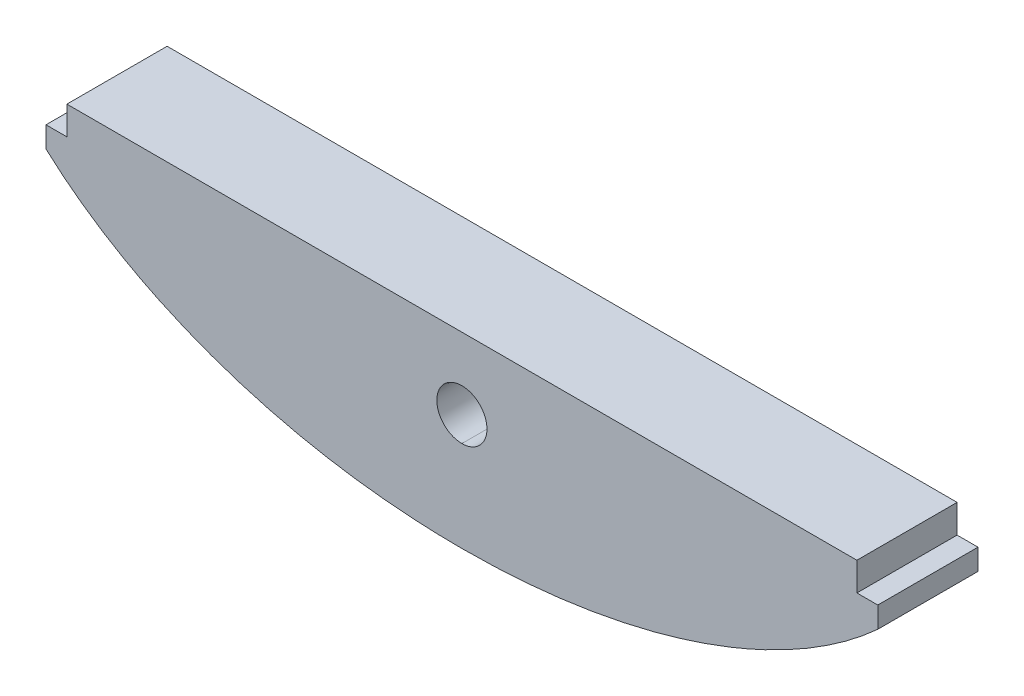
ISO-10303-21;
HEADER;
FILE_DESCRIPTION(('STEP AP214'),'2;1');
FILE_NAME('part.step','',(''),(''),'','','');
FILE_SCHEMA(('AUTOMOTIVE_DESIGN { 1 0 10303 214 1 1 1 1 }'));
ENDSEC;
DATA;
#1=APPLICATION_CONTEXT('core data for automotive mechanical design processes');
#2=APPLICATION_PROTOCOL_DEFINITION('international standard','automotive_design',2000,#1);
#3=PRODUCT_CONTEXT('',#1,'mechanical');
#4=PRODUCT('Part','Part','',(#3));
#5=PRODUCT_RELATED_PRODUCT_CATEGORY('part','',(#4));
#6=PRODUCT_DEFINITION_FORMATION('','',#4);
#7=PRODUCT_DEFINITION_CONTEXT('part definition',#1,'design');
#8=PRODUCT_DEFINITION('design','',#6,#7);
#9=PRODUCT_DEFINITION_SHAPE('','',#8);
#10=(LENGTH_UNIT() NAMED_UNIT(*) SI_UNIT(.MILLI.,.METRE.));
#11=(NAMED_UNIT(*) PLANE_ANGLE_UNIT() SI_UNIT($,.RADIAN.));
#12=(NAMED_UNIT(*) SI_UNIT($,.STERADIAN.) SOLID_ANGLE_UNIT());
#13=UNCERTAINTY_MEASURE_WITH_UNIT(LENGTH_MEASURE(1.E-05),#10,'distance_accuracy_value','');
#14=(GEOMETRIC_REPRESENTATION_CONTEXT(3) GLOBAL_UNCERTAINTY_ASSIGNED_CONTEXT((#13)) GLOBAL_UNIT_ASSIGNED_CONTEXT((#10,
#11,#12)) REPRESENTATION_CONTEXT('',''));
#15=CARTESIAN_POINT('',(0.,0.,0.));
#16=DIRECTION('',(0.,0.,1.));
#17=DIRECTION('',(1.,0.,0.));
#18=AXIS2_PLACEMENT_3D('',#15,#16,#17);
#19=CARTESIAN_POINT('',(-60.6492238058877,-4.51197664010296,10.));
#20=DIRECTION('',(0.,0.,-1.));
#21=DIRECTION('',(-1.,0.,0.));
#22=AXIS2_PLACEMENT_3D('',#19,#20,#21);
#23=PLANE('',#22);
#24=DIRECTION('',(-1.,0.,0.));
#25=VECTOR('',#24,1.);
#26=CARTESIAN_POINT('',(17.1731173942409,1.5862380164739,10.));
#27=LINE('',#26,#25);
#28=CARTESIAN_POINT('',(17.1731173942409,1.5862380164739,10.));
#29=VERTEX_POINT('',#28);
#30=CARTESIAN_POINT('',(15.0881886702613,1.5862380164739,10.));
#31=VERTEX_POINT('',#30);
#32=EDGE_CURVE('E238',#29,#31,#27,.T.);
#33=ORIENTED_EDGE('',*,*,#32,.T.);
#34=DIRECTION('',(0.,1.,0.));
#35=VECTOR('',#34,1.);
#36=CARTESIAN_POINT('',(15.0881886702613,1.5862380164739,10.));
#37=LINE('',#36,#35);
#38=CARTESIAN_POINT('',(15.0881886702613,4.41550115188855,10.));
#39=VERTEX_POINT('',#38);
#40=EDGE_CURVE('E328',#31,#39,#37,.T.);
#41=ORIENTED_EDGE('',*,*,#40,.T.);
#42=DIRECTION('',(-1.,0.,0.));
#43=VECTOR('',#42,1.);
#44=CARTESIAN_POINT('',(15.0881886702613,4.41550115188855,10.));
#45=LINE('',#44,#43);
#46=CARTESIAN_POINT('',(-63.7435197518711,4.41550115188855,10.));
#47=VERTEX_POINT('',#46);
#48=EDGE_CURVE('E271',#39,#47,#45,.T.);
#49=ORIENTED_EDGE('',*,*,#48,.T.);
#50=DIRECTION('',(0.,-1.,0.));
#51=VECTOR('',#50,1.);
#52=CARTESIAN_POINT('',(-63.7435197518711,4.41550115188855,10.));
#53=LINE('',#52,#51);
#54=CARTESIAN_POINT('',(-63.7435197518711,1.5862380164739,10.));
#55=VERTEX_POINT('',#54);
#56=EDGE_CURVE('E289',#47,#55,#53,.T.);
#57=ORIENTED_EDGE('',*,*,#56,.T.);
#58=DIRECTION('',(-1.,0.,0.));
#59=VECTOR('',#58,1.);
#60=CARTESIAN_POINT('',(-63.7435197518711,1.5862380164739,10.));
#61=LINE('',#60,#59);
#62=CARTESIAN_POINT('',(-65.8284484758507,1.5862380164739,10.));
#63=VERTEX_POINT('',#62);
#64=EDGE_CURVE('E286',#55,#63,#61,.T.);
#65=ORIENTED_EDGE('',*,*,#64,.T.);
#66=DIRECTION('',(0.,-1.,0.));
#67=VECTOR('',#66,1.);
#68=CARTESIAN_POINT('',(-65.8284484758507,1.5862380164739,10.));
#69=LINE('',#68,#67);
#70=CARTESIAN_POINT('',(-65.8284484758507,-0.512794067148492,10.));
#71=VERTEX_POINT('',#70);
#72=EDGE_CURVE('E288',#63,#71,#69,.T.);
#73=ORIENTED_EDGE('',*,*,#72,.T.);
#74=CARTESIAN_POINT('',(-65.8284484758507,-0.512794067148492,10.));
#75=CARTESIAN_POINT('',(-62.716945892807,-3.35618209405267,10.));
#76=CARTESIAN_POINT('',(-58.8963565315117,-5.86091723475676,10.));
#77=CARTESIAN_POINT('',(-54.5254346982945,-7.93172106724688,10.));
#78=B_SPLINE_CURVE_WITH_KNOTS('',3,(#74,#75,#76,#77),.UNSPECIFIED.,.F.,.F.,(4,4),(5.,6.),.UNSPECIFIED.);
#79=CARTESIAN_POINT('',(-54.5254346982945,-7.93172106724688,10.));
#80=VERTEX_POINT('',#79);
#81=EDGE_CURVE('E291',#71,#80,#78,.T.);
#82=ORIENTED_EDGE('',*,*,#81,.T.);
#83=CARTESIAN_POINT('',(-54.5254346982945,-7.93172106724688,10.));
#84=CARTESIAN_POINT('',(-46.1081620902643,-11.9216368716422,10.));
#85=CARTESIAN_POINT('',(-35.6518235919018,-14.2817210656594,10.));
#86=CARTESIAN_POINT('',(-24.3276655408049,-14.2817210656594,10.));
#87=B_SPLINE_CURVE_WITH_KNOTS('',3,(#83,#84,#85,#86),.UNSPECIFIED.,.F.,.F.,(4,4),(6.,7.),.UNSPECIFIED.);
#88=CARTESIAN_POINT('',(-24.3276655408049,-14.2817210656594,10.));
#89=VERTEX_POINT('',#88);
#90=EDGE_CURVE('E299',#80,#89,#87,.T.);
#91=ORIENTED_EDGE('',*,*,#90,.T.);
#92=CARTESIAN_POINT('',(-24.3276655408049,-14.2817210656594,10.));
#93=CARTESIAN_POINT('',(-13.003507489708,-14.2817210656594,10.));
#94=CARTESIAN_POINT('',(-2.54716899134551,-11.9216368716422,10.));
#95=CARTESIAN_POINT('',(5.87010361668473,-7.93172106724688,10.));
#96=B_SPLINE_CURVE_WITH_KNOTS('',3,(#92,#93,#94,#95),.UNSPECIFIED.,.F.,.F.,(4,4),(7.,8.),.UNSPECIFIED.);
#97=CARTESIAN_POINT('',(5.87010361668473,-7.93172106724688,10.));
#98=VERTEX_POINT('',#97);
#99=EDGE_CURVE('E185',#89,#98,#96,.T.);
#100=ORIENTED_EDGE('',*,*,#99,.T.);
#101=CARTESIAN_POINT('',(5.87010361668473,-7.93172106724688,10.));
#102=CARTESIAN_POINT('',(10.2410254499019,-5.86091723475676,10.));
#103=CARTESIAN_POINT('',(14.0616148111972,-3.35618209405267,10.));
#104=CARTESIAN_POINT('',(17.1731173942409,-0.512794067148492,10.));
#105=B_SPLINE_CURVE_WITH_KNOTS('',3,(#101,#102,#103,#104),.UNSPECIFIED.,.F.,.F.,(4,4),(8.,9.),.UNSPECIFIED.);
#106=CARTESIAN_POINT('',(17.1731173942409,-0.512794067148492,10.));
#107=VERTEX_POINT('',#106);
#108=EDGE_CURVE('E179',#98,#107,#105,.T.);
#109=ORIENTED_EDGE('',*,*,#108,.T.);
#110=DIRECTION('',(0.,1.,0.));
#111=VECTOR('',#110,1.);
#112=CARTESIAN_POINT('',(17.1731173942409,-0.512794067148492,10.));
#113=LINE('',#112,#111);
#114=EDGE_CURVE('E184',#107,#29,#113,.T.);
#115=ORIENTED_EDGE('',*,*,#114,.T.);
#116=EDGE_LOOP('',(#33,#41,#49,#57,#65,#73,#82,#91,#100,#109,#115));
#117=FACE_BOUND('',#116,.T.);
#118=CARTESIAN_POINT('',(-24.3276655408049,-5.21179664979535,10.));
#119=CARTESIAN_POINT('',(-22.9483139040512,-5.21179664979535,10.));
#120=CARTESIAN_POINT('',(-21.82648315482,-4.09349712343646,10.));
#121=CARTESIAN_POINT('',(-21.82648315482,-2.71061426381039,10.));
#122=CARTESIAN_POINT('',(-21.82648315482,-1.33124109520993,10.));
#123=CARTESIAN_POINT('',(-22.9483139040512,-0.209410345978656,10.));
#124=CARTESIAN_POINT('',(-24.3276655408049,-0.209410345978656,10.));
#125=B_SPLINE_CURVE_WITH_KNOTS('',3,(#118,#119,#120,#121,#122,#123,#124),.UNSPECIFIED.,.F.,.F.,
(4,3,4),(0.,1.,2.),.UNSPECIFIED.);
#126=CARTESIAN_POINT('',(-24.3276655408049,-5.21179664979535,10.));
#127=VERTEX_POINT('',#126);
#128=CARTESIAN_POINT('',(-24.3276655408049,-0.209410345978656,10.));
#129=VERTEX_POINT('',#128);
#130=EDGE_CURVE('E139',#127,#129,#125,.T.);
#131=ORIENTED_EDGE('',*,*,#130,.F.);
#132=CARTESIAN_POINT('',(-24.3276655408049,-0.209410345978656,10.));
#133=CARTESIAN_POINT('',(-25.7070387094054,-0.209410345978656,10.));
#134=CARTESIAN_POINT('',(-26.8288694586366,-1.33124109520993,10.));
#135=CARTESIAN_POINT('',(-26.8288694586366,-2.71061426381039,10.));
#136=CARTESIAN_POINT('',(-26.8288694586366,-4.09349712343646,10.));
#137=CARTESIAN_POINT('',(-25.7070387094054,-5.21179664979535,10.));
#138=CARTESIAN_POINT('',(-24.3276655408049,-5.21179664979535,10.));
#139=B_SPLINE_CURVE_WITH_KNOTS('',3,(#132,#133,#134,#135,#136,#137,#138),.UNSPECIFIED.,.F.,.F.,
(4,3,4),(2.,3.,4.),.UNSPECIFIED.);
#140=EDGE_CURVE('E133',#129,#127,#139,.T.);
#141=ORIENTED_EDGE('',*,*,#140,.F.);
#142=EDGE_LOOP('',(#131,#141));
#143=FACE_BOUND('',#142,.T.);
#144=ADVANCED_FACE('F39',(#117,#143),#23,.F.);
#145=CARTESIAN_POINT('',(-60.6492238058877,-4.51197664010296,0.));
#146=DIRECTION('',(0.,0.,-1.));
#147=DIRECTION('',(-1.,0.,0.));
#148=AXIS2_PLACEMENT_3D('',#145,#146,#147);
#149=PLANE('',#148);
#150=DIRECTION('',(-1.,0.,0.));
#151=VECTOR('',#150,1.);
#152=CARTESIAN_POINT('',(17.1731173942409,1.5862380164739,0.));
#153=LINE('',#152,#151);
#154=CARTESIAN_POINT('',(17.1731173942409,1.5862380164739,0.));
#155=VERTEX_POINT('',#154);
#156=CARTESIAN_POINT('',(15.0881886702613,1.5862380164739,0.));
#157=VERTEX_POINT('',#156);
#158=EDGE_CURVE('E195',#155,#157,#153,.T.);
#159=ORIENTED_EDGE('',*,*,#158,.F.);
#160=DIRECTION('',(0.,1.,0.));
#161=VECTOR('',#160,1.);
#162=CARTESIAN_POINT('',(17.1731173942409,-0.512794067148492,0.));
#163=LINE('',#162,#161);
#164=CARTESIAN_POINT('',(17.1731173942409,-0.512794067148492,0.));
#165=VERTEX_POINT('',#164);
#166=EDGE_CURVE('E233',#165,#155,#163,.T.);
#167=ORIENTED_EDGE('',*,*,#166,.F.);
#168=CARTESIAN_POINT('',(5.87010361668473,-7.93172106724688,0.));
#169=CARTESIAN_POINT('',(10.2410254499019,-5.86091723475676,0.));
#170=CARTESIAN_POINT('',(14.0616148111972,-3.35618209405267,0.));
#171=CARTESIAN_POINT('',(17.1731173942409,-0.512794067148492,0.));
#172=B_SPLINE_CURVE_WITH_KNOTS('',3,(#168,#169,#170,#171),.UNSPECIFIED.,.F.,.F.,(4,4),(8.,9.),.UNSPECIFIED.);
#173=CARTESIAN_POINT('',(5.87010361668473,-7.93172106724688,0.));
#174=VERTEX_POINT('',#173);
#175=EDGE_CURVE('E226',#174,#165,#172,.T.);
#176=ORIENTED_EDGE('',*,*,#175,.F.);
#177=CARTESIAN_POINT('',(-24.3276655408049,-14.2817210656594,0.));
#178=CARTESIAN_POINT('',(-13.003507489708,-14.2817210656594,0.));
#179=CARTESIAN_POINT('',(-2.54716899134551,-11.9216368716422,0.));
#180=CARTESIAN_POINT('',(5.87010361668473,-7.93172106724688,0.));
#181=B_SPLINE_CURVE_WITH_KNOTS('',3,(#177,#178,#179,#180),.UNSPECIFIED.,.F.,.F.,(4,4),(7.,8.),.UNSPECIFIED.);
#182=CARTESIAN_POINT('',(-24.3276655408049,-14.2817210656594,0.));
#183=VERTEX_POINT('',#182);
#184=EDGE_CURVE('E219',#183,#174,#181,.T.);
#185=ORIENTED_EDGE('',*,*,#184,.F.);
#186=CARTESIAN_POINT('',(-54.5254346982945,-7.93172106724688,0.));
#187=CARTESIAN_POINT('',(-46.1081620902643,-11.9216368716422,0.));
#188=CARTESIAN_POINT('',(-35.6518235919018,-14.2817210656594,0.));
#189=CARTESIAN_POINT('',(-24.3276655408049,-14.2817210656594,0.));
#190=B_SPLINE_CURVE_WITH_KNOTS('',3,(#186,#187,#188,#189),.UNSPECIFIED.,.F.,.F.,(4,4),(6.,7.),.UNSPECIFIED.);
#191=CARTESIAN_POINT('',(-54.5254346982945,-7.93172106724688,0.));
#192=VERTEX_POINT('',#191);
#193=EDGE_CURVE('E212',#192,#183,#190,.T.);
#194=ORIENTED_EDGE('',*,*,#193,.F.);
#195=CARTESIAN_POINT('',(-65.8284484758507,-0.512794067148492,0.));
#196=CARTESIAN_POINT('',(-62.716945892807,-3.35618209405267,0.));
#197=CARTESIAN_POINT('',(-58.8963565315117,-5.86091723475676,0.));
#198=CARTESIAN_POINT('',(-54.5254346982945,-7.93172106724688,0.));
#199=B_SPLINE_CURVE_WITH_KNOTS('',3,(#195,#196,#197,#198),.UNSPECIFIED.,.F.,.F.,(4,4),(5.,6.),.UNSPECIFIED.);
#200=CARTESIAN_POINT('',(-65.8284484758507,-0.512794067148492,0.));
#201=VERTEX_POINT('',#200);
#202=EDGE_CURVE('E208',#201,#192,#199,.T.);
#203=ORIENTED_EDGE('',*,*,#202,.F.);
#204=DIRECTION('',(0.,-1.,0.));
#205=VECTOR('',#204,1.);
#206=CARTESIAN_POINT('',(-65.8284484758507,1.5862380164739,0.));
#207=LINE('',#206,#205);
#208=CARTESIAN_POINT('',(-65.8284484758507,1.5862380164739,0.));
#209=VERTEX_POINT('',#208);
#210=EDGE_CURVE('E206',#209,#201,#207,.T.);
#211=ORIENTED_EDGE('',*,*,#210,.F.);
#212=DIRECTION('',(-1.,0.,0.));
#213=VECTOR('',#212,1.);
#214=CARTESIAN_POINT('',(-63.7435197518711,1.5862380164739,0.));
#215=LINE('',#214,#213);
#216=CARTESIAN_POINT('',(-63.7435197518711,1.5862380164739,0.));
#217=VERTEX_POINT('',#216);
#218=EDGE_CURVE('E204',#217,#209,#215,.T.);
#219=ORIENTED_EDGE('',*,*,#218,.F.);
#220=DIRECTION('',(0.,-1.,0.));
#221=VECTOR('',#220,1.);
#222=CARTESIAN_POINT('',(-63.7435197518711,4.41550115188855,0.));
#223=LINE('',#222,#221);
#224=CARTESIAN_POINT('',(-63.7435197518711,4.41550115188855,0.));
#225=VERTEX_POINT('',#224);
#226=EDGE_CURVE('E202',#225,#217,#223,.T.);
#227=ORIENTED_EDGE('',*,*,#226,.F.);
#228=DIRECTION('',(-1.,0.,0.));
#229=VECTOR('',#228,1.);
#230=CARTESIAN_POINT('',(15.0881886702613,4.41550115188855,0.));
#231=LINE('',#230,#229);
#232=CARTESIAN_POINT('',(15.0881886702613,4.41550115188855,0.));
#233=VERTEX_POINT('',#232);
#234=EDGE_CURVE('E200',#233,#225,#231,.T.);
#235=ORIENTED_EDGE('',*,*,#234,.F.);
#236=DIRECTION('',(0.,1.,0.));
#237=VECTOR('',#236,1.);
#238=CARTESIAN_POINT('',(15.0881886702613,1.5862380164739,0.));
#239=LINE('',#238,#237);
#240=EDGE_CURVE('E198',#157,#233,#239,.T.);
#241=ORIENTED_EDGE('',*,*,#240,.F.);
#242=EDGE_LOOP('',(#159,#167,#176,#185,#194,#203,#211,#219,#227,#235,#241));
#243=FACE_BOUND('',#242,.T.);
#244=CARTESIAN_POINT('',(-24.3276655408049,-0.209410345978656,0.));
#245=CARTESIAN_POINT('',(-25.7070387094054,-0.209410345978656,0.));
#246=CARTESIAN_POINT('',(-26.8288694586366,-1.33124109520993,0.));
#247=CARTESIAN_POINT('',(-26.8288694586366,-2.71061426381039,0.));
#248=CARTESIAN_POINT('',(-26.8288694586366,-4.09349712343646,0.));
#249=CARTESIAN_POINT('',(-25.7070387094054,-5.21179664979535,0.));
#250=CARTESIAN_POINT('',(-24.3276655408049,-5.21179664979535,0.));
#251=B_SPLINE_CURVE_WITH_KNOTS('',3,(#244,#245,#246,#247,#248,#249,#250),.UNSPECIFIED.,.F.,.F.,
(4,3,4),(2.,3.,4.),.UNSPECIFIED.);
#252=CARTESIAN_POINT('',(-24.3276655408049,-0.209410345978656,0.));
#253=VERTEX_POINT('',#252);
#254=CARTESIAN_POINT('',(-24.3276655408049,-5.21179664979535,0.));
#255=VERTEX_POINT('',#254);
#256=EDGE_CURVE('E143',#253,#255,#251,.T.);
#257=ORIENTED_EDGE('',*,*,#256,.T.);
#258=CARTESIAN_POINT('',(-24.3276655408049,-5.21179664979535,0.));
#259=CARTESIAN_POINT('',(-22.9483139040512,-5.21179664979535,0.));
#260=CARTESIAN_POINT('',(-21.82648315482,-4.09349712343646,0.));
#261=CARTESIAN_POINT('',(-21.82648315482,-2.71061426381039,0.));
#262=CARTESIAN_POINT('',(-21.82648315482,-1.33124109520993,0.));
#263=CARTESIAN_POINT('',(-22.9483139040512,-0.209410345978656,0.));
#264=CARTESIAN_POINT('',(-24.3276655408049,-0.209410345978656,0.));
#265=B_SPLINE_CURVE_WITH_KNOTS('',3,(#258,#259,#260,#261,#262,#263,#264),.UNSPECIFIED.,.F.,.F.,
(4,3,4),(0.,1.,2.),.UNSPECIFIED.);
#266=EDGE_CURVE('E61',#255,#253,#265,.T.);
#267=ORIENTED_EDGE('',*,*,#266,.T.);
#268=EDGE_LOOP('',(#257,#267));
#269=FACE_BOUND('',#268,.T.);
#270=ADVANCED_FACE('F163',(#243,#269),#149,.T.);
#271=CARTESIAN_POINT('',(17.1731173942409,1.5862380164739,10.));
#272=DIRECTION('',(0.,-1.,0.));
#273=DIRECTION('',(0.,0.,-1.));
#274=AXIS2_PLACEMENT_3D('',#271,#272,#273);
#275=PLANE('',#274);
#276=ORIENTED_EDGE('',*,*,#158,.T.);
#277=DIRECTION('',(0.,0.,-1.));
#278=VECTOR('',#277,1.);
#279=CARTESIAN_POINT('',(15.0881886702613,1.5862380164739,10.));
#280=LINE('',#279,#278);
#281=EDGE_CURVE('E11',#31,#157,#280,.T.);
#282=ORIENTED_EDGE('',*,*,#281,.F.);
#283=ORIENTED_EDGE('',*,*,#32,.F.);
#284=DIRECTION('',(0.,0.,-1.));
#285=VECTOR('',#284,1.);
#286=CARTESIAN_POINT('',(17.1731173942409,1.5862380164739,10.));
#287=LINE('',#286,#285);
#288=EDGE_CURVE('E194',#29,#155,#287,.T.);
#289=ORIENTED_EDGE('',*,*,#288,.T.);
#290=EDGE_LOOP('',(#276,#282,#283,#289));
#291=FACE_BOUND('',#290,.T.);
#292=ADVANCED_FACE('F41',(#291),#275,.F.);
#293=CARTESIAN_POINT('',(15.0881886702613,1.5862380164739,10.));
#294=DIRECTION('',(-1.,0.,0.));
#295=DIRECTION('',(0.,0.,1.));
#296=AXIS2_PLACEMENT_3D('',#293,#294,#295);
#297=PLANE('',#296);
#298=ORIENTED_EDGE('',*,*,#240,.T.);
#299=DIRECTION('',(0.,0.,-1.));
#300=VECTOR('',#299,1.);
#301=CARTESIAN_POINT('',(15.0881886702613,4.41550115188855,10.));
#302=LINE('',#301,#300);
#303=EDGE_CURVE('E47',#39,#233,#302,.T.);
#304=ORIENTED_EDGE('',*,*,#303,.F.);
#305=ORIENTED_EDGE('',*,*,#40,.F.);
#306=ORIENTED_EDGE('',*,*,#281,.T.);
#307=EDGE_LOOP('',(#298,#304,#305,#306));
#308=FACE_BOUND('',#307,.T.);
#309=ADVANCED_FACE('F321',(#308),#297,.F.);
#310=CARTESIAN_POINT('',(15.0881886702613,4.41550115188855,10.));
#311=DIRECTION('',(0.,-1.,0.));
#312=DIRECTION('',(0.,0.,-1.));
#313=AXIS2_PLACEMENT_3D('',#310,#311,#312);
#314=PLANE('',#313);
#315=ORIENTED_EDGE('',*,*,#234,.T.);
#316=DIRECTION('',(0.,0.,-1.));
#317=VECTOR('',#316,1.);
#318=CARTESIAN_POINT('',(-63.7435197518711,4.41550115188855,10.));
#319=LINE('',#318,#317);
#320=EDGE_CURVE('E262',#47,#225,#319,.T.);
#321=ORIENTED_EDGE('',*,*,#320,.F.);
#322=ORIENTED_EDGE('',*,*,#48,.F.);
#323=ORIENTED_EDGE('',*,*,#303,.T.);
#324=EDGE_LOOP('',(#315,#321,#322,#323));
#325=FACE_BOUND('',#324,.T.);
#326=ADVANCED_FACE('F269',(#325),#314,.F.);
#327=CARTESIAN_POINT('',(-63.7435197518711,4.41550115188855,10.));
#328=DIRECTION('',(1.,0.,0.));
#329=DIRECTION('',(0.,0.,-1.));
#330=AXIS2_PLACEMENT_3D('',#327,#328,#329);
#331=PLANE('',#330);
#332=ORIENTED_EDGE('',*,*,#226,.T.);
#333=DIRECTION('',(0.,0.,-1.));
#334=VECTOR('',#333,1.);
#335=CARTESIAN_POINT('',(-63.7435197518711,1.5862380164739,10.));
#336=LINE('',#335,#334);
#337=EDGE_CURVE('E259',#55,#217,#336,.T.);
#338=ORIENTED_EDGE('',*,*,#337,.F.);
#339=ORIENTED_EDGE('',*,*,#56,.F.);
#340=ORIENTED_EDGE('',*,*,#320,.T.);
#341=EDGE_LOOP('',(#332,#338,#339,#340));
#342=FACE_BOUND('',#341,.T.);
#343=ADVANCED_FACE('F280',(#342),#331,.F.);
#344=CARTESIAN_POINT('',(-63.7435197518711,1.5862380164739,10.));
#345=DIRECTION('',(0.,-1.,0.));
#346=DIRECTION('',(0.,0.,-1.));
#347=AXIS2_PLACEMENT_3D('',#344,#345,#346);
#348=PLANE('',#347);
#349=ORIENTED_EDGE('',*,*,#218,.T.);
#350=DIRECTION('',(0.,0.,-1.));
#351=VECTOR('',#350,1.);
#352=CARTESIAN_POINT('',(-65.8284484758507,1.5862380164739,10.));
#353=LINE('',#352,#351);
#354=EDGE_CURVE('E256',#63,#209,#353,.T.);
#355=ORIENTED_EDGE('',*,*,#354,.F.);
#356=ORIENTED_EDGE('',*,*,#64,.F.);
#357=ORIENTED_EDGE('',*,*,#337,.T.);
#358=EDGE_LOOP('',(#349,#355,#356,#357));
#359=FACE_BOUND('',#358,.T.);
#360=ADVANCED_FACE('F284',(#359),#348,.F.);
#361=CARTESIAN_POINT('',(-65.8284484758507,1.5862380164739,10.));
#362=DIRECTION('',(1.,0.,0.));
#363=DIRECTION('',(0.,0.,-1.));
#364=AXIS2_PLACEMENT_3D('',#361,#362,#363);
#365=PLANE('',#364);
#366=ORIENTED_EDGE('',*,*,#210,.T.);
#367=DIRECTION('',(0.,0.,-1.));
#368=VECTOR('',#367,1.);
#369=CARTESIAN_POINT('',(-65.8284484758507,-0.512794067148492,10.));
#370=LINE('',#369,#368);
#371=EDGE_CURVE('E253',#71,#201,#370,.T.);
#372=ORIENTED_EDGE('',*,*,#371,.F.);
#373=ORIENTED_EDGE('',*,*,#72,.F.);
#374=ORIENTED_EDGE('',*,*,#354,.T.);
#375=EDGE_LOOP('',(#366,#372,#373,#374));
#376=FACE_BOUND('',#375,.T.);
#377=ADVANCED_FACE('F311',(#376),#365,.F.);
#378=DIRECTION('',(0.,0.,-1.));
#379=VECTOR('',#378,1.);
#380=SURFACE_OF_LINEAR_EXTRUSION('',#78,#379);
#381=ORIENTED_EDGE('',*,*,#202,.T.);
#382=DIRECTION('',(0.,0.,-1.));
#383=VECTOR('',#382,1.);
#384=CARTESIAN_POINT('',(-54.5254346982945,-7.93172106724688,10.));
#385=LINE('',#384,#383);
#386=EDGE_CURVE('E250',#80,#192,#385,.T.);
#387=ORIENTED_EDGE('',*,*,#386,.F.);
#388=ORIENTED_EDGE('',*,*,#81,.F.);
#389=ORIENTED_EDGE('',*,*,#371,.T.);
#390=EDGE_LOOP('',(#381,#387,#388,#389));
#391=FACE_BOUND('',#390,.T.);
#392=ADVANCED_FACE('F307',(#391),#380,.F.);
#393=DIRECTION('',(0.,0.,-1.));
#394=VECTOR('',#393,1.);
#395=SURFACE_OF_LINEAR_EXTRUSION('',#87,#394);
#396=ORIENTED_EDGE('',*,*,#193,.T.);
#397=DIRECTION('',(0.,0.,-1.));
#398=VECTOR('',#397,1.);
#399=CARTESIAN_POINT('',(-24.3276655408049,-14.2817210656594,10.));
#400=LINE('',#399,#398);
#401=EDGE_CURVE('E247',#89,#183,#400,.T.);
#402=ORIENTED_EDGE('',*,*,#401,.F.);
#403=ORIENTED_EDGE('',*,*,#90,.F.);
#404=ORIENTED_EDGE('',*,*,#386,.T.);
#405=EDGE_LOOP('',(#396,#402,#403,#404));
#406=FACE_BOUND('',#405,.T.);
#407=ADVANCED_FACE('F310',(#406),#395,.F.);
#408=DIRECTION('',(0.,0.,-1.));
#409=VECTOR('',#408,1.);
#410=SURFACE_OF_LINEAR_EXTRUSION('',#96,#409);
#411=ORIENTED_EDGE('',*,*,#184,.T.);
#412=DIRECTION('',(0.,0.,-1.));
#413=VECTOR('',#412,1.);
#414=CARTESIAN_POINT('',(5.87010361668473,-7.93172106724688,10.));
#415=LINE('',#414,#413);
#416=EDGE_CURVE('E244',#98,#174,#415,.T.);
#417=ORIENTED_EDGE('',*,*,#416,.F.);
#418=ORIENTED_EDGE('',*,*,#99,.F.);
#419=ORIENTED_EDGE('',*,*,#401,.T.);
#420=EDGE_LOOP('',(#411,#417,#418,#419));
#421=FACE_BOUND('',#420,.T.);
#422=ADVANCED_FACE('F175',(#421),#410,.F.);
#423=DIRECTION('',(0.,0.,-1.));
#424=VECTOR('',#423,1.);
#425=SURFACE_OF_LINEAR_EXTRUSION('',#105,#424);
#426=ORIENTED_EDGE('',*,*,#175,.T.);
#427=DIRECTION('',(0.,0.,-1.));
#428=VECTOR('',#427,1.);
#429=CARTESIAN_POINT('',(17.1731173942409,-0.512794067148492,10.));
#430=LINE('',#429,#428);
#431=EDGE_CURVE('E241',#107,#165,#430,.T.);
#432=ORIENTED_EDGE('',*,*,#431,.F.);
#433=ORIENTED_EDGE('',*,*,#108,.F.);
#434=ORIENTED_EDGE('',*,*,#416,.T.);
#435=EDGE_LOOP('',(#426,#432,#433,#434));
#436=FACE_BOUND('',#435,.T.);
#437=ADVANCED_FACE('F170',(#436),#425,.F.);
#438=CARTESIAN_POINT('',(17.1731173942409,-0.512794067148492,10.));
#439=DIRECTION('',(-1.,0.,0.));
#440=DIRECTION('',(0.,0.,1.));
#441=AXIS2_PLACEMENT_3D('',#438,#439,#440);
#442=PLANE('',#441);
#443=ORIENTED_EDGE('',*,*,#166,.T.);
#444=ORIENTED_EDGE('',*,*,#288,.F.);
#445=ORIENTED_EDGE('',*,*,#114,.F.);
#446=ORIENTED_EDGE('',*,*,#431,.T.);
#447=EDGE_LOOP('',(#443,#444,#445,#446));
#448=FACE_BOUND('',#447,.T.);
#449=ADVANCED_FACE('F160',(#448),#442,.F.);
#450=DIRECTION('',(0.,0.,-1.));
#451=VECTOR('',#450,1.);
#452=SURFACE_OF_LINEAR_EXTRUSION('',#125,#451);
#453=ORIENTED_EDGE('',*,*,#266,.F.);
#454=DIRECTION('',(0.,0.,-1.));
#455=VECTOR('',#454,1.);
#456=CARTESIAN_POINT('',(-24.3276655408049,-5.21179664979535,10.));
#457=LINE('',#456,#455);
#458=EDGE_CURVE('E135',#127,#255,#457,.T.);
#459=ORIENTED_EDGE('',*,*,#458,.F.);
#460=ORIENTED_EDGE('',*,*,#130,.T.);
#461=DIRECTION('',(0.,0.,-1.));
#462=VECTOR('',#461,1.);
#463=CARTESIAN_POINT('',(-24.3276655408049,-0.209410345978656,10.));
#464=LINE('',#463,#462);
#465=EDGE_CURVE('E54',#129,#253,#464,.T.);
#466=ORIENTED_EDGE('',*,*,#465,.T.);
#467=EDGE_LOOP('',(#453,#459,#460,#466));
#468=FACE_BOUND('',#467,.T.);
#469=ADVANCED_FACE('F141',(#468),#452,.T.);
#470=DIRECTION('',(0.,0.,-1.));
#471=VECTOR('',#470,1.);
#472=SURFACE_OF_LINEAR_EXTRUSION('',#139,#471);
#473=ORIENTED_EDGE('',*,*,#256,.F.);
#474=ORIENTED_EDGE('',*,*,#465,.F.);
#475=ORIENTED_EDGE('',*,*,#140,.T.);
#476=ORIENTED_EDGE('',*,*,#458,.T.);
#477=EDGE_LOOP('',(#473,#474,#475,#476));
#478=FACE_BOUND('',#477,.T.);
#479=ADVANCED_FACE('F134',(#478),#472,.T.);
#480=CLOSED_SHELL('',(#144,#270,#292,#309,#326,#343,#360,#377,#392,#407,#422,#437,#449,#469,#479));
#481=MANIFOLD_SOLID_BREP('B2',#480);
#482=ADVANCED_BREP_SHAPE_REPRESENTATION('',(#18,#481),#14);
#483=SHAPE_DEFINITION_REPRESENTATION(#9,#482);
ENDSEC;
END-ISO-10303-21;
